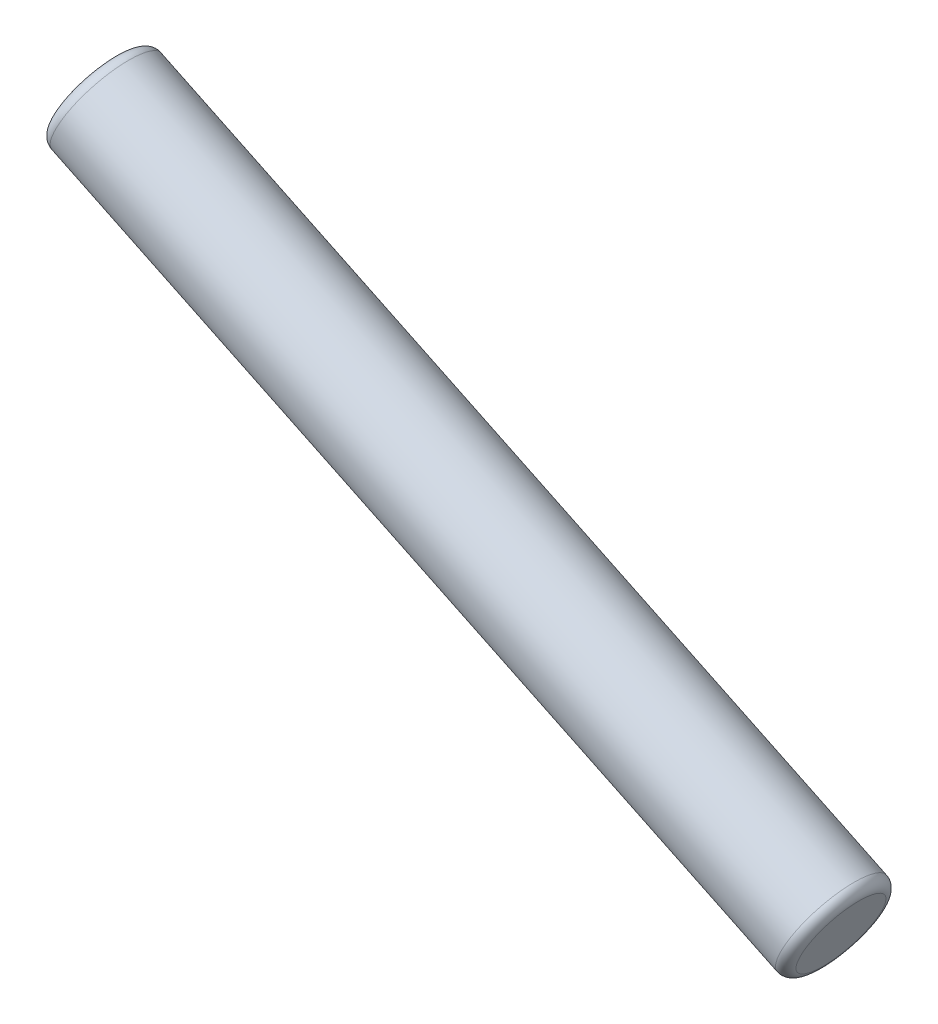
ISO-10303-21;
HEADER;
FILE_DESCRIPTION(('STEP AP214'),'2;1');
FILE_NAME('part.step','',(''),(''),'','','');
FILE_SCHEMA(('AUTOMOTIVE_DESIGN { 1 0 10303 214 1 1 1 1 }'));
ENDSEC;
DATA;
#1=APPLICATION_CONTEXT('core data for automotive mechanical design processes');
#2=APPLICATION_PROTOCOL_DEFINITION('international standard','automotive_design',2000,#1);
#3=PRODUCT_CONTEXT('',#1,'mechanical');
#4=PRODUCT('Part','Part','',(#3));
#5=PRODUCT_RELATED_PRODUCT_CATEGORY('part','',(#4));
#6=PRODUCT_DEFINITION_FORMATION('','',#4);
#7=PRODUCT_DEFINITION_CONTEXT('part definition',#1,'design');
#8=PRODUCT_DEFINITION('design','',#6,#7);
#9=PRODUCT_DEFINITION_SHAPE('','',#8);
#10=(LENGTH_UNIT() NAMED_UNIT(*) SI_UNIT(.MILLI.,.METRE.));
#11=(NAMED_UNIT(*) PLANE_ANGLE_UNIT() SI_UNIT($,.RADIAN.));
#12=(NAMED_UNIT(*) SI_UNIT($,.STERADIAN.) SOLID_ANGLE_UNIT());
#13=UNCERTAINTY_MEASURE_WITH_UNIT(LENGTH_MEASURE(1.E-05),#10,'distance_accuracy_value','');
#14=(GEOMETRIC_REPRESENTATION_CONTEXT(3) GLOBAL_UNCERTAINTY_ASSIGNED_CONTEXT((#13)) GLOBAL_UNIT_ASSIGNED_CONTEXT((#10,
#11,#12)) REPRESENTATION_CONTEXT('',''));
#15=CARTESIAN_POINT('',(0.,0.,0.));
#16=DIRECTION('',(0.,0.,1.));
#17=DIRECTION('',(1.,0.,0.));
#18=AXIS2_PLACEMENT_3D('',#15,#16,#17);
#19=CARTESIAN_POINT('',(-19.4228984178457,-17.2844154384824,0.));
#20=DIRECTION('',(0.900968867902417,-0.433883739117562,0.));
#21=DIRECTION('',(0.433883739117562,0.900968867902417,0.));
#22=AXIS2_PLACEMENT_3D('',#19,#20,#21);
#23=PLANE('',#22);
#24=CARTESIAN_POINT('',(-19.6806136525423,-17.8195666375527,0.804484960666696));
#25=CARTESIAN_POINT('',(-19.6857098595455,-17.8301490204375,0.795813169941099));
#26=CARTESIAN_POINT('',(-19.6907235883955,-17.8405601356697,0.786883943187514));
#27=CARTESIAN_POINT('',(-19.7005767500758,-17.8610204367247,0.768528472119868));
#28=CARTESIAN_POINT('',(-19.7054161827572,-17.8710696222382,0.759102227381022));
#29=CARTESIAN_POINT('',(-19.714911412126,-17.8907866692095,0.739770572454061));
#30=CARTESIAN_POINT('',(-19.7195672084853,-17.9004545299859,0.729865161409916));
#31=CARTESIAN_POINT('',(-19.7286862661439,-17.9193904484024,0.709594198177795));
#32=CARTESIAN_POINT('',(-19.7331495269197,-17.9286585049556,0.699228644739024));
#33=CARTESIAN_POINT('',(-19.7418749587265,-17.9467770509673,0.678057233139869));
#34=CARTESIAN_POINT('',(-19.7461371290233,-17.9556275389014,0.667251373372372));
#35=CARTESIAN_POINT('',(-19.754452216346,-17.9728939959747,0.645220046476913));
#36=CARTESIAN_POINT('',(-19.758505132413,-17.9813099631225,0.633994577426463));
#37=CARTESIAN_POINT('',(-19.766393946364,-17.9976912546612,0.611145527468171));
#38=CARTESIAN_POINT('',(-19.7702298430513,-18.005656576567,0.59952194436547));
#39=CARTESIAN_POINT('',(-19.7776772689775,-18.0211213167667,0.575898925074206));
#40=CARTESIAN_POINT('',(-19.7812887967701,-18.0286207320571,0.563899486463427));
#41=CARTESIAN_POINT('',(-19.7882805647496,-18.0431392892314,0.539547734047541));
#42=CARTESIAN_POINT('',(-19.79166080323,-18.0501584275717,0.527195417639686));
#43=CARTESIAN_POINT('',(-19.7981835149484,-18.0637029799622,0.502161562938774));
#44=CARTESIAN_POINT('',(-19.8013259862105,-18.0702283899094,0.489480021910908));
#45=CARTESIAN_POINT('',(-19.8073671406408,-18.0827729790099,0.463812002241695));
#46=CARTESIAN_POINT('',(-19.8102658215558,-18.0887921534845,0.450825520783424));
#47=CARTESIAN_POINT('',(-19.8158138390622,-18.1003127340937,0.424572485855942));
#48=CARTESIAN_POINT('',(-19.8184631731168,-18.1058141349605,0.411305929538901));
#49=CARTESIAN_POINT('',(-19.8235074167823,-18.1162886194684,0.384518156431533));
#50=CARTESIAN_POINT('',(-19.8259023235676,-18.121261697242,0.370996936814908));
#51=CARTESIAN_POINT('',(-19.8304331226542,-18.1306700043461,0.343725700724282));
#52=CARTESIAN_POINT('',(-19.8325690118374,-18.1351052272021,0.329975681498346));
#53=CARTESIAN_POINT('',(-19.8365776686866,-18.1434292962365,0.302273281489317));
#54=CARTESIAN_POINT('',(-19.8384504329399,-18.1473181353287,0.288320898084297));
#55=CARTESIAN_POINT('',(-19.8419292829437,-18.1545420507948,0.26024009530973));
#56=CARTESIAN_POINT('',(-19.843535364987,-18.1578771194709,0.246111673496032));
#57=CARTESIAN_POINT('',(-19.8459890254458,-18.1629722070204,0.222424254659047));
#58=CARTESIAN_POINT('',(-19.8469113626687,-18.1648874638736,0.212906056071148));
#59=CARTESIAN_POINT('',(-19.8486349287527,-18.1684664939694,0.193811657602421));
#60=CARTESIAN_POINT('',(-19.8494361563638,-18.1701302646164,0.184235457124005));
#61=CARTESIAN_POINT('',(-19.8516570748386,-18.1747420632676,0.155431965310361));
#62=CARTESIAN_POINT('',(-19.8528941795,-18.177310947928,0.136128063402954));
#63=CARTESIAN_POINT('',(-19.8548767234854,-18.1814277660804,0.0973877077946516));
#64=CARTESIAN_POINT('',(-19.8556221514347,-18.1829756759524,0.07795125103765));
#65=CARTESIAN_POINT('',(-19.8566189547613,-18.1850455880325,0.0390092767483628));
#66=CARTESIAN_POINT('',(-19.8568703178878,-18.1855675648016,0.0195037575156239));
#67=CARTESIAN_POINT('',(-19.8568763539164,-18.1855801258498,-0.0114584574732943));
#68=CARTESIAN_POINT('',(-19.85679314053,-18.1854073419235,-0.0229163068789262));
#69=CARTESIAN_POINT('',(-19.8564558432317,-18.1847069579211,-0.045819127023401));
#70=CARTESIAN_POINT('',(-19.8562017567615,-18.1841793525328,-0.0572640975668546));
#71=CARTESIAN_POINT('',(-19.8555230150353,-18.1827699522587,-0.0801274385562966));
#72=CARTESIAN_POINT('',(-19.8550983573259,-18.1818881522786,-0.091545808617312));
#73=CARTESIAN_POINT('',(-19.854333847447,-18.1803006474997,-0.108642708516948));
#74=CARTESIAN_POINT('',(-19.8540577488863,-18.1797273283924,-0.1143367004308));
#75=CARTESIAN_POINT('',(-19.8534631289082,-18.1784925982308,-0.125712876429319));
#76=CARTESIAN_POINT('',(-19.8531446072044,-18.1778311865819,-0.131395060434019));
#77=CARTESIAN_POINT('',(-19.8517822324546,-18.1750022082832,-0.154156840454747));
#78=CARTESIAN_POINT('',(-19.8505675440121,-18.1724798983293,-0.171184085457275));
#79=CARTESIAN_POINT('',(-19.8477576367434,-18.166645098814,-0.20507009494491));
#80=CARTESIAN_POINT('',(-19.84616241086,-18.1633325945978,-0.221928856299344));
#81=CARTESIAN_POINT('',(-19.8425956134797,-18.1559260961029,-0.255434190532962));
#82=CARTESIAN_POINT('',(-19.8406240355049,-18.1518320883728,-0.272080759754598));
#83=CARTESIAN_POINT('',(-19.8363098246697,-18.1428735689553,-0.305116699351479));
#84=CARTESIAN_POINT('',(-19.8339671859172,-18.1380090450329,-0.321506065638088));
#85=CARTESIAN_POINT('',(-19.828917113949,-18.1275224929442,-0.35398377844055));
#86=CARTESIAN_POINT('',(-19.826209675427,-18.1219004537592,-0.370072120573916));
#87=CARTESIAN_POINT('',(-19.8204372499754,-18.1099139175635,-0.401904635955964));
#88=CARTESIAN_POINT('',(-19.8173722583216,-18.1035494107428,-0.417648804653935));
#89=CARTESIAN_POINT('',(-19.8108929301022,-18.0900949738557,-0.448750781981962));
#90=CARTESIAN_POINT('',(-19.8074785893866,-18.0830050351713,-0.464108586019417));
#91=CARTESIAN_POINT('',(-19.8003097043286,-18.0681187164919,-0.494396668468572));
#92=CARTESIAN_POINT('',(-19.7965551563981,-18.0603223290461,-0.509326942368995));
#93=CARTESIAN_POINT('',(-19.7887159108332,-18.0440439899076,-0.538719947392004));
#94=CARTESIAN_POINT('',(-19.7846312101567,-18.035562031898,-0.553182674204876));
#95=CARTESIAN_POINT('',(-19.7761425988543,-18.0179352681605,-0.581601820504499));
#96=CARTESIAN_POINT('',(-19.7717386857126,-18.0087904572084,-0.595558235999561));
#97=CARTESIAN_POINT('',(-19.7626234456641,-17.9898624825258,-0.622927352705561));
#98=CARTESIAN_POINT('',(-19.7579121167442,-17.9800793146151,-0.636340050354981));
#99=CARTESIAN_POINT('',(-19.7481946661073,-17.9599008336522,-0.662585782228768));
#100=CARTESIAN_POINT('',(-19.7431885428526,-17.9495055174071,-0.67541881342903));
#101=CARTESIAN_POINT('',(-19.732894915418,-17.928130589758,-0.700470817689011));
#102=CARTESIAN_POINT('',(-19.7276074101455,-17.9171509760851,-0.712689788363829));
#103=CARTESIAN_POINT('',(-19.7167651854498,-17.894636871151,-0.73648092363476));
#104=CARTESIAN_POINT('',(-19.7112104653452,-17.8831023784747,-0.748053086580995));
#105=CARTESIAN_POINT('',(-19.6998486946312,-17.8595094217193,-0.770519593182157));
#106=CARTESIAN_POINT('',(-19.6940416437147,-17.8474509570021,-0.781413936011576));
#107=CARTESIAN_POINT('',(-19.6821907719354,-17.8228423679903,-0.802495607172832));
#108=CARTESIAN_POINT('',(-19.6761469510999,-17.8102922437523,-0.812682935585943));
#109=CARTESIAN_POINT('',(-19.6638387351759,-17.7847339664116,-0.832323279111155));
#110=CARTESIAN_POINT('',(-19.6575743404069,-17.771725813972,-0.841776295286351));
#111=CARTESIAN_POINT('',(-19.6448417639584,-17.7452863395298,-0.859922685234537));
#112=CARTESIAN_POINT('',(-19.6383735828458,-17.7318550187041,-0.868616061119705));
#113=CARTESIAN_POINT('',(-19.6252507676273,-17.704605201781,-0.885219879094437));
#114=CARTESIAN_POINT('',(-19.6185961342884,-17.6907867072766,-0.893130324404385));
#115=CARTESIAN_POINT('',(-19.6051182485644,-17.6627995756271,-0.908147090071756));
#116=CARTESIAN_POINT('',(-19.5982949970978,-17.6486309403894,-0.915253414808414));
#117=CARTESIAN_POINT('',(-19.5844981612077,-17.6199814988038,-0.928642905292383));
#118=CARTESIAN_POINT('',(-19.5775245778035,-17.6055006945728,-0.934926076619659));
#119=CARTESIAN_POINT('',(-19.5634457671671,-17.5762657234677,-0.946652434453706));
#120=CARTESIAN_POINT('',(-19.5563405410031,-17.561511558812,-0.952095627774026));
#121=CARTESIAN_POINT('',(-19.5420174868303,-17.5317694080507,-0.962127457118807));
#122=CARTESIAN_POINT('',(-19.5347996598855,-17.5167814241547,-0.96671610121401));
#123=CARTESIAN_POINT('',(-19.5202707478554,-17.4866118026528,-0.975026552082317));
#124=CARTESIAN_POINT('',(-19.512959663776,-17.4714301671357,-0.978748368197555));
#125=CARTESIAN_POINT('',(-19.4982638309591,-17.4409139288175,-0.985315208460204));
#126=CARTESIAN_POINT('',(-19.4908790831149,-17.4255793278713,-0.988160243225788));
#127=CARTESIAN_POINT('',(-19.4760557134155,-17.3947982545539,-0.992965918204943));
#128=CARTESIAN_POINT('',(-19.4686170922859,-17.3793517836895,-0.994926570307726));
#129=CARTESIAN_POINT('',(-19.4537059106855,-17.348388365477,-0.997958249797573));
#130=CARTESIAN_POINT('',(-19.4462333507178,-17.3328714191736,-0.999029290330203));
#131=CARTESIAN_POINT('',(-19.4312743166049,-17.301808632954,-1.00027890291891));
#132=CARTESIAN_POINT('',(-19.4237878426858,-17.2862627935073,-1.00045748935252));
#133=CARTESIAN_POINT('',(-19.4088210425586,-17.2551838801474,-0.999921743953029));
#134=CARTESIAN_POINT('',(-19.4013407162455,-17.2396508060164,-0.999207427695392));
#135=CARTESIAN_POINT('',(-19.3864062560758,-17.2086390468533,-0.996887822229119));
#136=CARTESIAN_POINT('',(-19.3789521217301,-17.1931603608055,-0.995282549750231));
#137=CARTESIAN_POINT('',(-19.3640900192799,-17.1622988540395,-0.991185366954885));
#138=CARTESIAN_POINT('',(-19.3566820502501,-17.1469160313996,-0.988693474469375));
#139=CARTESIAN_POINT('',(-19.3419321276242,-17.1162874689773,-0.982829764863971));
#140=CARTESIAN_POINT('',(-19.3345901726158,-17.1010417262623,-0.979457966613841));
#141=CARTESIAN_POINT('',(-19.3199919493621,-17.0707281718974,-0.971843518588018));
#142=CARTESIAN_POINT('',(-19.3127356791689,-17.0556603562026,-0.967600888649431));
#143=CARTESIAN_POINT('',(-19.2983282661299,-17.0257430249562,-0.958256186053284));
#144=CARTESIAN_POINT('',(-19.2911771207537,-17.01089350415,-0.95315413411985));
#145=CARTESIAN_POINT('',(-19.2769991152697,-16.9814525448172,-0.942104300367218));
#146=CARTESIAN_POINT('',(-19.269972252004,-16.9668610997336,-0.93615654007031));
#147=CARTESIAN_POINT('',(-19.2560616335727,-16.9379753781798,-0.923431273017876));
#148=CARTESIAN_POINT('',(-19.2491778745799,-16.9236810937625,-0.916653788485631));
#149=CARTESIAN_POINT('',(-19.2355719056453,-16.8954279869078,-0.902287270920184));
#150=CARTESIAN_POINT('',(-19.2288496911675,-16.8814691550512,-0.894698260706578));
#151=CARTESIAN_POINT('',(-19.2155848069183,-16.8539243220358,-0.878729103942054));
#152=CARTESIAN_POINT('',(-19.2090421318659,-16.8403383099106,-0.870348980693518));
#153=CARTESIAN_POINT('',(-19.1961538804864,-16.8135755680228,-0.852819987741268));
#154=CARTESIAN_POINT('',(-19.1898082980988,-16.8003988256753,-0.843671141707612));
#155=CARTESIAN_POINT('',(-19.1773311034451,-16.7744896575478,-0.8246296881203));
#156=CARTESIAN_POINT('',(-19.171199484314,-16.7617572175123,-0.814737104461525));
#157=CARTESIAN_POINT('',(-19.165183183149,-16.7492642394121,-0.804484960666688));
#158=B_SPLINE_CURVE_WITH_KNOTS('',3,(#24,#25,#26,#27,#28,#29,#30,#31,#32,#33,#34,#35,#36,#37,
#38,#39,#40,#41,#42,#43,#44,#45,#46,#47,#48,#49,#50,#51,#52,#53,#54,#55,#56,#57,#58,#59,#60,#61,
#62,#63,#64,#65,#66,#67,#68,#69,#70,#71,#72,#73,#74,#75,#76,#77,#78,#79,#80,#81,#82,#83,#84,#85,
#86,#87,#88,#89,#90,#91,#92,#93,#94,#95,#96,#97,#98,#99,#100,#101,#102,#103,#104,#105,#106,#107,
#108,#109,#110,#111,#112,#113,#114,#115,#116,#117,#118,#119,#120,#121,#122,#123,#124,#125,#126,
#127,#128,#129,#130,#131,#132,#133,#134,#135,#136,#137,#138,#139,#140,#141,#142,#143,#144,#145,
#146,#147,#148,#149,#150,#151,#152,#153,#154,#155,#156,#157),.UNSPECIFIED.,.F.,.F.,(4,2,2,2,2,2,
2,2,2,2,2,2,2,2,2,2,2,2,2,2,2,2,2,2,2,2,2,2,2,2,2,2,2,2,2,2,2,2,2,2,2,2,2,2,2,2,2,2,2,2,2,2,2,2,
2,2,2,2,2,2,2,2,2,2,2,2,4),(0.,0.0437962799276957,0.0875925972872954,0.131388992891872,
0.17518550755449,0.218982182088205,0.262779057306064,0.306576174021098,0.350373573046334,
0.394171295194785,0.437969381279454,0.481767872113333,0.525566808509399,0.569366231280619,
0.613166181239949,0.656966699200325,0.700767825974673,0.73002191650991,0.759276308961499,
0.817779796446782,0.876284637344527,0.934790928904775,0.969163374995058,1.00353633571332,
1.03790979083846,1.05509733247404,1.07228499013269,1.12402668271729,1.17576933495718,
1.22751287788054,1.27925724251557,1.33100235989045,1.38274816103343,1.43449457697275,
1.48624153873667,1.53798897735347,1.58973682385145,1.64148500925893,1.69323346460425,
1.74498212091573,1.79673090922175,1.84847976055067,1.90022860593087,1.95197737639074,
2.00372600295866,2.05547441666305,2.10722254853231,2.15897032959483,2.21071769087902,
2.26246456341329,2.31421087822604,2.36595656634567,2.41770155880059,2.46944578661919,
2.52118918082987,2.57293167246101,2.62467319254101,2.67641367209826,2.72815304216117,
2.7798912337581,2.83162817791748,2.88336380566771,2.93509804803721,2.98683083605443,
3.03856210074782,3.09029177314588,3.14201978427711),.UNSPECIFIED.);
#159=CARTESIAN_POINT('',(-19.6806136525423,-17.8195666375527,0.804484960666695));
#160=VERTEX_POINT('',#159);
#161=CARTESIAN_POINT('',(-19.165183183149,-16.7492642394121,-0.804484960666691));
#162=VERTEX_POINT('',#161);
#163=EDGE_CURVE('E44',#160,#162,#158,.T.);
#164=ORIENTED_EDGE('',*,*,#163,.F.);
#165=CARTESIAN_POINT('',(-19.4228984178457,-17.2844154384824,0.));
#166=DIRECTION('',(-0.900968867902417,0.433883739117562,0.));
#167=DIRECTION('',(-0.433883739117562,-0.900968867902417,0.));
#168=AXIS2_PLACEMENT_3D('',#165,#166,#167);
#169=CIRCLE('',#168,1.);
#170=EDGE_CURVE('E22',#162,#160,#169,.F.);
#171=ORIENTED_EDGE('',*,*,#170,.F.);
#172=EDGE_LOOP('',(#164,#171));
#173=FACE_BOUND('',#172,.T.);
#174=ADVANCED_FACE('F17',(#173),#23,.F.);
#175=CARTESIAN_POINT('',(-1.40352105979733,-25.9620902208336,0.));
#176=DIRECTION('',(0.900968867902417,-0.433883739117562,0.));
#177=DIRECTION('',(0.433883739117562,0.900968867902417,0.));
#178=AXIS2_PLACEMENT_3D('',#175,#176,#177);
#179=PLANE('',#178);
#180=CARTESIAN_POINT('',(-1.661236294494,-26.4972414199039,0.804484960666691));
#181=CARTESIAN_POINT('',(-1.6561595778875,-26.4866995092462,0.813124127862061));
#182=CARTESIAN_POINT('',(-1.65100098170671,-26.4759875739005,0.821507671839126));
#183=CARTESIAN_POINT('',(-1.64053008063863,-26.4542445237912,0.837748345104224));
#184=CARTESIAN_POINT('',(-1.63521777575134,-26.4432134090277,0.845605474392256));
#185=CARTESIAN_POINT('',(-1.62444950771229,-26.4208528700405,0.860778150026863));
#186=CARTESIAN_POINT('',(-1.61899354456053,-26.409523445817,0.868093696373439));
#187=CARTESIAN_POINT('',(-1.60794836229641,-26.3865878885165,0.882169337307863));
#188=CARTESIAN_POINT('',(-1.60235914318405,-26.3749817554396,0.888929431895712));
#189=CARTESIAN_POINT('',(-1.59105808395561,-26.3515148641478,0.901881285884714));
#190=CARTESIAN_POINT('',(-1.58534624383954,-26.339654105933,0.908073045285866));
#191=CARTESIAN_POINT('',(-1.57381081660551,-26.3157005444629,0.919876446609359));
#192=CARTESIAN_POINT('',(-1.56798722948754,-26.3036077412076,0.9254880885317));
#193=CARTESIAN_POINT('',(-1.55623939346007,-26.2792131083332,0.936120571726647));
#194=CARTESIAN_POINT('',(-1.55031514455056,-26.266911278714,0.941141412999254));
#195=CARTESIAN_POINT('',(-1.53837726216991,-26.2421220105208,0.950582737730492));
#196=CARTESIAN_POINT('',(-1.53236362869876,-26.2296345719468,0.955003221189125));
#197=CARTESIAN_POINT('',(-1.52025842446506,-26.2044978563456,0.963235415572535));
#198=CARTESIAN_POINT('',(-1.5141668537025,-26.1918485793184,0.967047126497313));
#199=CARTESIAN_POINT('',(-1.50191737054327,-26.1664122654413,0.974054520025627));
#200=CARTESIAN_POINT('',(-1.4957594581466,-26.1536252285914,0.977250202629162));
#201=CARTESIAN_POINT('',(-1.48338901365374,-26.1279377359169,0.983019456345897));
#202=CARTESIAN_POINT('',(-1.47717648155755,-26.1150372800923,0.985593027459096));
#203=CARTESIAN_POINT('',(-1.46470862357404,-26.0891475062201,0.990113159257779));
#204=CARTESIAN_POINT('',(-1.45845329768672,-26.0761581881725,0.992059719943263));
#205=CARTESIAN_POINT('',(-1.44591175948919,-26.0501154157594,0.995322125497213));
#206=CARTESIAN_POINT('',(-1.43962554717897,-26.0370619613939,0.996637970365679));
#207=CARTESIAN_POINT('',(-1.4270342022981,-26.0109157643371,0.998636439500204));
#208=CARTESIAN_POINT('',(-1.42072906972743,-25.9978230216459,0.999319063766264));
#209=CARTESIAN_POINT('',(-1.40811188650387,-25.9716231707177,1.00004979228186));
#210=CARTESIAN_POINT('',(-1.40179983585096,-25.9585160624807,1.0000978965314));
#211=CARTESIAN_POINT('',(-1.38918083181007,-25.9323124305864,0.999559493444784));
#212=CARTESIAN_POINT('',(-1.38287387842209,-25.919215906929,0.998972986108633));
#213=CARTESIAN_POINT('',(-1.3702770745553,-25.8930583741712,0.99716647630069));
#214=CARTESIAN_POINT('',(-1.36398722407648,-25.8799973650707,0.995946473828898));
#215=CARTESIAN_POINT('',(-1.35143659911589,-25.8539357237997,0.992875296093719));
#216=CARTESIAN_POINT('',(-1.34517582463412,-25.8409350916292,0.991024120830333));
#217=CARTESIAN_POINT('',(-1.33269526940768,-25.8150189516604,0.986694121329292));
#218=CARTESIAN_POINT('',(-1.32647548866302,-25.8021034438621,0.984215297091638));
#219=CARTESIAN_POINT('',(-1.31408876061696,-25.7763821380409,0.978634718224887));
#220=CARTESIAN_POINT('',(-1.30792181331556,-25.763576340018,0.975532963595789));
#221=CARTESIAN_POINT('',(-1.29565249129072,-25.738098830312,0.96871242831238));
#222=CARTESIAN_POINT('',(-1.28955011656728,-25.7254271186289,0.964993647658068));
#223=CARTESIAN_POINT('',(-1.27742155591548,-25.7002419029258,0.956946139234562));
#224=CARTESIAN_POINT('',(-1.27139536998713,-25.6877283989059,0.952617411465368));
#225=CARTESIAN_POINT('',(-1.25943065811291,-25.6628834186952,0.943358248791457));
#226=CARTESIAN_POINT('',(-1.25349213216703,-25.6505519425045,0.93842781388674));
#227=CARTESIAN_POINT('',(-1.24171404457954,-25.6260944916184,0.92797462230477));
#228=CARTESIAN_POINT('',(-1.23587448293791,-25.6139685169229,0.922451865627518));
#229=CARTESIAN_POINT('',(-1.224305439896,-25.5899451515085,0.910824543382006));
#230=CARTESIAN_POINT('',(-1.21857595849572,-25.5780477607896,0.904719977813746));
#231=CARTESIAN_POINT('',(-1.20723798233142,-25.5545042106906,0.891940658172622));
#232=CARTESIAN_POINT('',(-1.20162948756741,-25.5428580513106,0.885265904099759));
#233=CARTESIAN_POINT('',(-1.19054416075884,-25.5198391330046,0.871358913227339));
#234=CARTESIAN_POINT('',(-1.18506732871429,-25.5084663740786,0.864126676427784));
#235=CARTESIAN_POINT('',(-1.17425575282571,-25.4860159054153,0.849118487060234));
#236=CARTESIAN_POINT('',(-1.16892100898169,-25.474938195678,0.841342534492239));
#237=CARTESIAN_POINT('',(-1.15840376440768,-25.4530989122871,0.825261715613509));
#238=CARTESIAN_POINT('',(-1.15322126367769,-25.4423373386335,0.816956849302772));
#239=CARTESIAN_POINT('',(-1.14301837079492,-25.4211508132555,0.799834011507038));
#240=CARTESIAN_POINT('',(-1.13799797864214,-25.410725861531,0.791016040022039));
#241=CARTESIAN_POINT('',(-1.12812885847623,-25.3902324223413,0.772883778195894));
#242=CARTESIAN_POINT('',(-1.1232801304631,-25.380163934876,0.763569487854747));
#243=CARTESIAN_POINT('',(-1.11376357228485,-25.3604025981967,0.744462315581078));
#244=CARTESIAN_POINT('',(-1.10909574211973,-25.3507097489826,0.734669433648555));
#245=CARTESIAN_POINT('',(-1.09994985064087,-25.3317181096378,0.714623730756397));
#246=CARTESIAN_POINT('',(-1.09547178932712,-25.3224193195071,0.70437090979676));
#247=CARTESIAN_POINT('',(-1.08671401382285,-25.3042336112794,0.683424803666434));
#248=CARTESIAN_POINT('',(-1.08243429963233,-25.2953466931822,0.672731518495745));
#249=CARTESIAN_POINT('',(-1.07408116341988,-25.278001227134,0.650924996007963));
#250=CARTESIAN_POINT('',(-1.07000774139794,-25.2695426791828,0.639811758690871));
#251=CARTESIAN_POINT('',(-1.06207569602074,-25.2530716171438,0.617185901446276));
#252=CARTESIAN_POINT('',(-1.05821707266546,-25.2450591030558,0.605673281518772));
#253=CARTESIAN_POINT('',(-1.04978553280941,-25.2275508305362,0.579358960108008));
#254=CARTESIAN_POINT('',(-1.04527404044972,-25.2181826208191,0.564452161620082));
#255=CARTESIAN_POINT('',(-1.03877178111152,-25.204680535272,0.541692688669788));
#256=CARTESIAN_POINT('',(-1.03664842486034,-25.2002713379563,0.534039258648485));
#257=CARTESIAN_POINT('',(-1.03249152566775,-25.1916394372629,0.518603406581231));
#258=CARTESIAN_POINT('',(-1.03045798470563,-25.187416737995,0.510820981697758));
#259=CARTESIAN_POINT('',(-1.02598518973169,-25.1781288554563,0.493171818645867));
#260=CARTESIAN_POINT('',(-1.02357162047349,-25.1731170045791,0.483270453112172));
#261=CARTESIAN_POINT('',(-1.01888970697236,-25.1633948395245,0.463286296242781));
#262=CARTESIAN_POINT('',(-1.01662137141758,-25.1586845433868,0.45320349409935));
#263=CARTESIAN_POINT('',(-1.01223288806398,-25.1495716316077,0.432867044619366));
#264=CARTESIAN_POINT('',(-1.01011275178831,-25.1451690398917,0.422613384074431));
#265=CARTESIAN_POINT('',(-1.00602134758244,-25.1366729148839,0.40194842012481));
#266=CARTESIAN_POINT('',(-1.00405009389823,-25.1325794111676,0.391537101748607));
#267=CARTESIAN_POINT('',(-0.999891051959724,-25.1239427146862,0.368488967570027));
#268=CARTESIAN_POINT('',(-0.997737516579801,-25.119470644778,0.355819149838043));
#269=CARTESIAN_POINT('',(-0.993668615589501,-25.1110212070931,0.33027812269897));
#270=CARTESIAN_POINT('',(-0.99175325396034,-25.1070438475856,0.31740690992949));
#271=CARTESIAN_POINT('',(-0.987562846469158,-25.0983423822385,0.287169880737167));
#272=CARTESIAN_POINT('',(-0.985380560537464,-25.0938109506917,0.269735270559878));
#273=CARTESIAN_POINT('',(-0.981453773960021,-25.0856573436375,0.23461004918569));
#274=CARTESIAN_POINT('',(-0.979709184283928,-25.0820349832189,0.216919490825921));
#275=CARTESIAN_POINT('',(-0.977411473060383,-25.0772641596414,0.190241139426089));
#276=CARTESIAN_POINT('',(-0.976698801473337,-25.0757844139628,0.181325198083527));
#277=CARTESIAN_POINT('',(-0.975402818208019,-25.0730934673921,0.163445573661034));
#278=CARTESIAN_POINT('',(-0.974819480862707,-25.0718822132166,0.154481900415971));
#279=CARTESIAN_POINT('',(-0.974142493010634,-25.0704764409157,0.143717174194266));
#280=CARTESIAN_POINT('',(-0.974030346586725,-25.0702435656236,0.141921443307056));
#281=CARTESIAN_POINT('',(-0.973654874137559,-25.0694638874085,0.135812201993998));
#282=CARTESIAN_POINT('',(-0.973399864870008,-25.0689343561303,0.131495918085239));
#283=CARTESIAN_POINT('',(-0.972775059203709,-25.0676369339395,0.120378212917031));
#284=CARTESIAN_POINT('',(-0.972423318208386,-25.0669065341798,0.113571377106026));
#285=CARTESIAN_POINT('',(-0.971661886567687,-25.0653253969809,0.0974421864564643));
#286=CARTESIAN_POINT('',(-0.971278288018323,-25.0645288391498,0.0881132435154438));
#287=CARTESIAN_POINT('',(-0.970537076136202,-25.0629896725856,0.0669269048460096));
#288=CARTESIAN_POINT('',(-0.970214083427366,-25.0623189522204,0.0550630475729545));
#289=CARTESIAN_POINT('',(-0.969702052422042,-25.0612556513031,0.0288024242194235));
#290=CARTESIAN_POINT('',(-0.969555838242226,-25.0609519926969,0.0144010545894244));
#291=CARTESIAN_POINT('',(-0.969539446019039,-25.0609178800162,-0.00812273544697117));
#292=CARTESIAN_POINT('',(-0.969576716527646,-25.0609952446315,-0.0162453706674516));
#293=CARTESIAN_POINT('',(-0.9697388061107,-25.0613317760548,-0.032486197292686));
#294=CARTESIAN_POINT('',(-0.969863627578306,-25.0615909478325,-0.0406043885698965));
#295=CARTESIAN_POINT('',(-0.970368899700597,-25.0626400988448,-0.0649446665275739));
#296=CARTESIAN_POINT('',(-0.970880157406664,-25.0637017123679,-0.081153362755175));
#297=CARTESIAN_POINT('',(-0.972246751724003,-25.0665394658909,-0.11340627286812));
#298=CARTESIAN_POINT('',(-0.973100255265458,-25.0683117992752,-0.12945090330737));
#299=CARTESIAN_POINT('',(-0.975149356108486,-25.0725668637077,-0.161423136969609));
#300=CARTESIAN_POINT('',(-0.976344938172039,-25.0750495631124,-0.17735074537298));
#301=CARTESIAN_POINT('',(-0.979074401146449,-25.0807174591259,-0.209049833489773));
#302=CARTESIAN_POINT('',(-0.980608253637701,-25.0839025967198,-0.22482132620293));
#303=CARTESIAN_POINT('',(-0.984013529921014,-25.0909738221032,-0.256167598981487));
#304=CARTESIAN_POINT('',(-0.985884912022131,-25.0948598233235,-0.271742403087507));
#305=CARTESIAN_POINT('',(-0.989595753004993,-25.1025654652524,-0.299975977037225));
#306=CARTESIAN_POINT('',(-0.991384125054219,-25.106279034361,-0.312670660746692));
#307=CARTESIAN_POINT('',(-0.995167953105917,-25.1141362004086,-0.337893829570824));
#308=CARTESIAN_POINT('',(-0.997163392035746,-25.1182797618948,-0.350422328291514));
#309=CARTESIAN_POINT('',(-1.00188667428974,-25.1280877715078,-0.378401948344381));
#310=CARTESIAN_POINT('',(-1.00467291587807,-25.1338734938234,-0.393800846567957));
#311=CARTESIAN_POINT('',(-1.01055833361125,-25.1460947168653,-0.424280130875776));
#312=CARTESIAN_POINT('',(-1.01365754285082,-25.1525302863096,-0.439360483071099));
#313=CARTESIAN_POINT('',(-1.01886774705381,-25.1633492417415,-0.463161462928938));
#314=CARTESIAN_POINT('',(-1.02087542241963,-25.1675181375519,-0.472002662422916));
#315=CARTESIAN_POINT('',(-1.02501377019809,-25.1761113639095,-0.489531672447506));
#316=CARTESIAN_POINT('',(-1.02714444984851,-25.1805357094878,-0.498219473912557));
#317=CARTESIAN_POINT('',(-1.0322539015774,-25.1911455249387,-0.518304624057881));
#318=CARTESIAN_POINT('',(-1.03527865289651,-25.1974264920148,-0.529639972840836));
#319=CARTESIAN_POINT('',(-1.04153398946316,-25.2104159377314,-0.55200378511954));
#320=CARTESIAN_POINT('',(-1.04476455757181,-25.2171243807749,-0.563032274058695));
#321=CARTESIAN_POINT('',(-1.04975913579157,-25.2274958733356,-0.579330897175699));
#322=CARTESIAN_POINT('',(-1.05144872639381,-25.2310043915707,-0.584722917757638));
#323=CARTESIAN_POINT('',(-1.05487807948316,-25.2381255882369,-0.59542073743852));
#324=CARTESIAN_POINT('',(-1.05661783638594,-25.2417382550745,-0.600726546032257));
#325=CARTESIAN_POINT('',(-1.06116736751009,-25.2511854532959,-0.614326715937382));
#326=CARTESIAN_POINT('',(-1.06401025245844,-25.25708870282,-0.622562069112307));
#327=CARTESIAN_POINT('',(-1.07268811413563,-25.2751083256601,-0.646983371187818));
#328=CARTESIAN_POINT('',(-1.07867360862307,-25.2875372953599,-0.662888709282311));
#329=CARTESIAN_POINT('',(-1.08717004259834,-25.3051804308859,-0.684188286583585));
#330=CARTESIAN_POINT('',(-1.08951473639314,-25.3100492837433,-0.689939503947798));
#331=CARTESIAN_POINT('',(-1.09425572570543,-25.319894120235,-0.701329384694134));
#332=CARTESIAN_POINT('',(-1.0966520269102,-25.3248701156767,-0.706968035537814));
#333=CARTESIAN_POINT('',(-1.10311156458523,-25.3382834551608,-0.721802681476182));
#334=CARTESIAN_POINT('',(-1.10722685432994,-25.3468288262825,-0.730879177363326));
#335=CARTESIAN_POINT('',(-1.11562684875211,-25.3642714424741,-0.748607578643448));
#336=CARTESIAN_POINT('',(-1.11991156879122,-25.3731687194501,-0.75725944537667));
#337=CARTESIAN_POINT('',(-1.127765400481,-25.389477423091,-0.772443208254273));
#338=CARTESIAN_POINT('',(-1.13130624137739,-25.3968301212,-0.779053018971099));
#339=CARTESIAN_POINT('',(-1.13848444084841,-25.4117359339361,-0.791985961147515));
#340=CARTESIAN_POINT('',(-1.14212178747104,-25.4192890237452,-0.798309127846989));
#341=CARTESIAN_POINT('',(-1.14580582510066,-25.4269390217633,-0.804484960666693));
#342=B_SPLINE_CURVE_WITH_KNOTS('',3,(#180,#181,#182,#183,#184,#185,#186,#187,#188,#189,#190,
#191,#192,#193,#194,#195,#196,#197,#198,#199,#200,#201,#202,#203,#204,#205,#206,#207,#208,#209,
#210,#211,#212,#213,#214,#215,#216,#217,#218,#219,#220,#221,#222,#223,#224,#225,#226,#227,#228,
#229,#230,#231,#232,#233,#234,#235,#236,#237,#238,#239,#240,#241,#242,#243,#244,#245,#246,#247,
#248,#249,#250,#251,#252,#253,#254,#255,#256,#257,#258,#259,#260,#261,#262,#263,#264,#265,#266,
#267,#268,#269,#270,#271,#272,#273,#274,#275,#276,#277,#278,#279,#280,#281,#282,#283,#284,#285,
#286,#287,#288,#289,#290,#291,#292,#293,#294,#295,#296,#297,#298,#299,#300,#301,#302,#303,#304,
#305,#306,#307,#308,#309,#310,#311,#312,#313,#314,#315,#316,#317,#318,#319,#320,#321,#322,#323,
#324,#325,#326,#327,#328,#329,#330,#331,#332,#333,#334,#335,#336,#337,#338,#339,#340,#341),
.UNSPECIFIED.,.F.,.F.,(4,2,2,2,2,2,2,2,2,2,2,2,2,2,2,2,2,2,2,2,2,2,2,2,2,2,2,2,2,2,2,2,2,2,2,2,
2,2,2,2,2,2,2,2,2,2,2,2,2,2,2,2,2,2,2,2,2,2,2,2,2,2,2,2,2,2,2,2,2,2,2,2,2,2,2,2,2,2,2,2,4),(0.,
0.0436297700691213,0.0872595401382445,0.130889310207367,0.174519080276489,0.218148850345613,
0.261778620414734,0.305408390483857,0.34903816055298,0.392667930622102,0.436297700691225,
0.479927470760347,0.523557240829469,0.567187010898591,0.610816780967714,0.654446551036836,
0.69807632110596,0.741706091175082,0.785335861244203,0.828965631313327,0.872595401382448,
0.916225171451571,0.959854941520694,1.00348471158982,1.04711448165894,1.09074425172806,
1.13437402179718,1.17800379186631,1.22163356193543,1.26526333200455,1.30889310207367,
1.3525228721428,1.39615264221192,1.43978241228104,1.48341218235016,1.52704195241929,
1.57067172248841,1.62516691788097,1.65241724430506,1.67966817095645,1.71373257422511,
1.74779901338837,1.78186809842391,1.81594043927578,1.85674977386325,1.89755979051142,
1.95196587833819,2.00636089061452,2.03355479763022,2.06074330303617,2.06618605186255,
2.07925403392026,2.09981743759569,2.12792596438914,2.16358031108225,2.20678142365013,
2.23114847303701,2.25551618850974,2.30424890620209,2.3527240250824,2.40119698495604,
2.44966587395074,2.49812878026549,2.53816043150344,2.57818878475423,2.62822240034847,
2.67826131229277,2.70819333334979,2.73812711745687,2.77803757695228,2.81794471733477,
2.83789700984498,2.85784708984605,2.88941525438396,2.95253621235054,2.97621037143515,
2.99988715296269,3.03925827122481,3.07863296735015,3.11013258106002,3.14162831166104),.UNSPECIFIED.);
#343=CARTESIAN_POINT('',(-1.66123629449399,-26.4972414199039,0.804484960666692));
#344=VERTEX_POINT('',#343);
#345=CARTESIAN_POINT('',(-1.14580582510066,-25.4269390217633,-0.804484960666692));
#346=VERTEX_POINT('',#345);
#347=EDGE_CURVE('E47',#344,#346,#342,.T.);
#348=ORIENTED_EDGE('',*,*,#347,.F.);
#349=CARTESIAN_POINT('',(-1.66123629449399,-26.4972414199039,0.80448496066669));
#350=CARTESIAN_POINT('',(-1.7109792029899,-26.6005336337234,0.719838931533699));
#351=CARTESIAN_POINT('',(-1.74866250908954,-26.6787838251329,0.605993116740621));
#352=CARTESIAN_POINT('',(-1.79635527042833,-26.7778188645145,0.461907529876492));
#353=CARTESIAN_POINT('',(-1.8191250132334,-26.8251007226437,0.28720415674892));
#354=CARTESIAN_POINT('',(-1.8468006900222,-26.8825698576602,0.0748594618622625));
#355=CARTESIAN_POINT('',(-1.83278670800568,-26.8534695241517,-0.145512682898664));
#356=CARTESIAN_POINT('',(-1.81708930951987,-26.8208735403254,-0.392356825227827));
#357=CARTESIAN_POINT('',(-1.75257400259524,-26.68690612509,-0.593973019640721));
#358=CARTESIAN_POINT('',(-1.68832480901059,-26.553491299899,-0.794757585693683));
#359=CARTESIAN_POINT('',(-1.59023119299705,-26.3497978073797,-0.902674998820256));
#360=CARTESIAN_POINT('',(-1.50341493298005,-26.169521985884,-0.998185660768594));
#361=CARTESIAN_POINT('',(-1.40678063771874,-25.9688588041312,-0.999971780317787));
#362=CARTESIAN_POINT('',(-1.32815473592553,-25.8055904367328,-1.00142504553679));
#363=CARTESIAN_POINT('',(-1.25384925847195,-25.6512935229179,-0.938618007739426));
#364=CARTESIAN_POINT('',(-1.19579188421422,-25.530736143043,-0.889544751979803));
#365=CARTESIAN_POINT('',(-1.14580582510066,-25.4269390217633,-0.804484960666692));
#366=B_SPLINE_CURVE_WITH_KNOTS('',2,(#349,#350,#351,#352,#353,#354,#355,#356,#357,#358,#359,
#360,#361,#362,#363,#364,#365),.UNSPECIFIED.,.F.,.F.,(3,2,2,2,2,2,2,2,3),(0.,0.125,0.25,0.375,
0.5,0.625,0.75,0.875,1.),.UNSPECIFIED.);
#367=EDGE_CURVE('E36',#344,#346,#366,.T.);
#368=ORIENTED_EDGE('',*,*,#367,.T.);
#369=EDGE_LOOP('',(#348,#368));
#370=FACE_BOUND('',#369,.T.);
#371=ADVANCED_FACE('F63',(#370),#179,.T.);
#372=CARTESIAN_POINT('',(-19.1976562008701,-17.3928863732618,0.));
#373=DIRECTION('',(-0.900968867902417,0.433883739117562,0.));
#374=DIRECTION('',(-0.433883739117562,-0.900968867902417,0.));
#375=AXIS2_PLACEMENT_3D('',#372,#373,#374);
#376=TOROIDAL_SURFACE('',#375,1.,0.25);
#377=CARTESIAN_POINT('',(-19.1976562008701,-17.3928863732618,0.));
#378=DIRECTION('',(0.900968867902417,-0.433883739117562,0.));
#379=DIRECTION('',(0.433883739117562,0.900968867902417,0.));
#380=AXIS2_PLACEMENT_3D('',#377,#378,#379);
#381=CIRCLE('',#380,1.25);
#382=CARTESIAN_POINT('',(-18.6553015269731,-16.2666752883837,0.));
#383=VERTEX_POINT('',#382);
#384=EDGE_CURVE('E28',#383,#383,#381,.T.);
#385=ORIENTED_EDGE('',*,*,#384,.F.);
#386=EDGE_LOOP('',(#385));
#387=FACE_BOUND('',#386,.T.);
#388=ORIENTED_EDGE('',*,*,#170,.T.);
#389=ORIENTED_EDGE('',*,*,#163,.T.);
#390=EDGE_LOOP('',(#388,#389));
#391=FACE_BOUND('',#390,.T.);
#392=ADVANCED_FACE('F48',(#387,#391),#376,.T.);
#393=CARTESIAN_POINT('',(-1.62876327677293,-25.8536192860542,0.));
#394=DIRECTION('',(0.900968867902416,-0.433883739117565,0.));
#395=DIRECTION('',(0.433883739117565,0.900968867902416,0.));
#396=AXIS2_PLACEMENT_3D('',#393,#394,#395);
#397=TOROIDAL_SURFACE('',#396,0.999999999999997,0.249999999999999);
#398=ORIENTED_EDGE('',*,*,#347,.T.);
#399=ORIENTED_EDGE('',*,*,#367,.F.);
#400=EDGE_LOOP('',(#398,#399));
#401=FACE_BOUND('',#400,.T.);
#402=CARTESIAN_POINT('',(-1.62876327677293,-25.8536192860542,0.));
#403=DIRECTION('',(0.900968867902417,-0.433883739117562,0.));
#404=DIRECTION('',(0.433883739117562,0.900968867902417,0.));
#405=AXIS2_PLACEMENT_3D('',#402,#403,#404);
#406=CIRCLE('',#405,1.25);
#407=CARTESIAN_POINT('',(-1.08640860287597,-24.7274082011762,0.));
#408=VERTEX_POINT('',#407);
#409=EDGE_CURVE('E11',#408,#408,#406,.F.);
#410=ORIENTED_EDGE('',*,*,#409,.F.);
#411=EDGE_LOOP('',(#410));
#412=FACE_BOUND('',#411,.T.);
#413=ADVANCED_FACE('F19',(#401,#412),#397,.T.);
#414=CARTESIAN_POINT('',(-10.4132097388215,-21.623252829658,0.));
#415=DIRECTION('',(0.900968867902417,-0.433883739117562,0.));
#416=DIRECTION('',(0.433883739117562,0.900968867902417,0.));
#417=AXIS2_PLACEMENT_3D('',#414,#415,#416);
#418=CYLINDRICAL_SURFACE('',#417,1.25);
#419=ORIENTED_EDGE('',*,*,#384,.T.);
#420=EDGE_LOOP('',(#419));
#421=FACE_BOUND('',#420,.T.);
#422=ORIENTED_EDGE('',*,*,#409,.T.);
#423=EDGE_LOOP('',(#422));
#424=FACE_BOUND('',#423,.T.);
#425=ADVANCED_FACE('F70',(#421,#424),#418,.T.);
#426=CLOSED_SHELL('',(#174,#371,#392,#413,#425));
#427=MANIFOLD_SOLID_BREP('B1',#426);
#428=ADVANCED_BREP_SHAPE_REPRESENTATION('',(#18,#427),#14);
#429=SHAPE_DEFINITION_REPRESENTATION(#9,#428);
ENDSEC;
END-ISO-10303-21;
